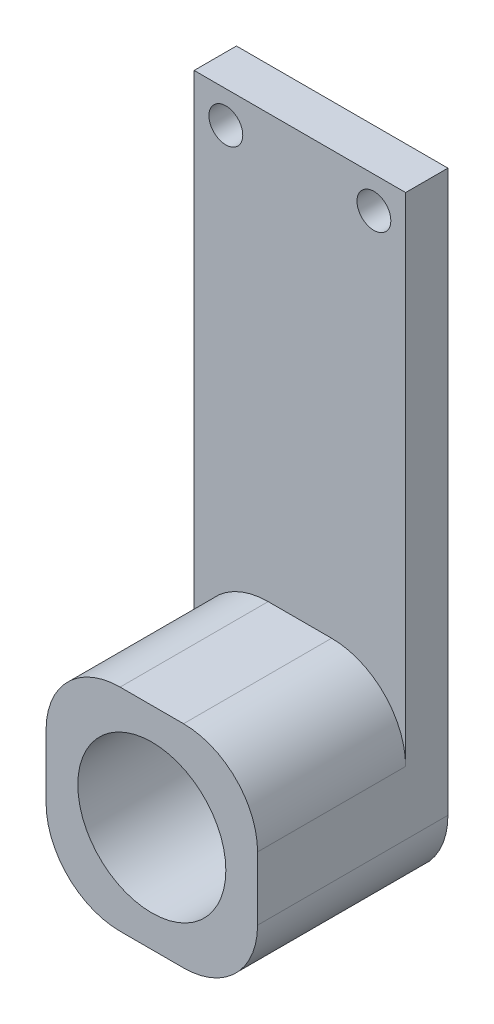
ISO-10303-21;
HEADER;
FILE_DESCRIPTION(('STEP AP214'),'2;1');
FILE_NAME('part.step','',(''),(''),'','','');
FILE_SCHEMA(('AUTOMOTIVE_DESIGN { 1 0 10303 214 1 1 1 1 }'));
ENDSEC;
DATA;
#1=APPLICATION_CONTEXT('core data for automotive mechanical design processes');
#2=APPLICATION_PROTOCOL_DEFINITION('international standard','automotive_design',2000,#1);
#3=PRODUCT_CONTEXT('',#1,'mechanical');
#4=PRODUCT('Part','Part','',(#3));
#5=PRODUCT_RELATED_PRODUCT_CATEGORY('part','',(#4));
#6=PRODUCT_DEFINITION_FORMATION('','',#4);
#7=PRODUCT_DEFINITION_CONTEXT('part definition',#1,'design');
#8=PRODUCT_DEFINITION('design','',#6,#7);
#9=PRODUCT_DEFINITION_SHAPE('','',#8);
#10=(LENGTH_UNIT() NAMED_UNIT(*) SI_UNIT(.MILLI.,.METRE.));
#11=(NAMED_UNIT(*) PLANE_ANGLE_UNIT() SI_UNIT($,.RADIAN.));
#12=(NAMED_UNIT(*) SI_UNIT($,.STERADIAN.) SOLID_ANGLE_UNIT());
#13=UNCERTAINTY_MEASURE_WITH_UNIT(LENGTH_MEASURE(1.E-05),#10,'distance_accuracy_value','');
#14=(GEOMETRIC_REPRESENTATION_CONTEXT(3) GLOBAL_UNCERTAINTY_ASSIGNED_CONTEXT((#13)) GLOBAL_UNIT_ASSIGNED_CONTEXT((#10,
#11,#12)) REPRESENTATION_CONTEXT('',''));
#15=CARTESIAN_POINT('',(0.,0.,0.));
#16=DIRECTION('',(0.,0.,1.));
#17=DIRECTION('',(1.,0.,0.));
#18=AXIS2_PLACEMENT_3D('',#15,#16,#17);
#19=CARTESIAN_POINT('',(-17.8635678666033,21.6884788398443,2.));
#20=DIRECTION('',(1.,0.,0.));
#21=DIRECTION('',(0.,1.,0.));
#22=AXIS2_PLACEMENT_3D('',#19,#20,#21);
#23=PLANE('',#22);
#24=DIRECTION('',(0.,-1.,0.));
#25=VECTOR('',#24,1.);
#26=CARTESIAN_POINT('',(-17.8635678666033,21.6884788398443,0.));
#27=LINE('',#26,#25);
#28=CARTESIAN_POINT('',(-17.8635678666033,21.6884788398443,0.));
#29=VERTEX_POINT('',#28);
#30=CARTESIAN_POINT('',(-17.8635678666033,-4.8115211601557,0.));
#31=VERTEX_POINT('',#30);
#32=EDGE_CURVE('E137',#29,#31,#27,.T.);
#33=ORIENTED_EDGE('',*,*,#32,.T.);
#34=DIRECTION('',(0.,0.,-1.));
#35=VECTOR('',#34,1.);
#36=CARTESIAN_POINT('',(-17.8635678666033,-4.8115211601557,2.));
#37=LINE('',#36,#35);
#38=CARTESIAN_POINT('',(-17.8635678666033,-4.8115211601557,9.));
#39=VERTEX_POINT('',#38);
#40=EDGE_CURVE('E159',#31,#39,#37,.F.);
#41=ORIENTED_EDGE('',*,*,#40,.T.);
#42=DIRECTION('',(0.,-1.,0.));
#43=VECTOR('',#42,1.);
#44=CARTESIAN_POINT('',(-17.8635678666033,1.68847883984431,9.));
#45=LINE('',#44,#43);
#46=CARTESIAN_POINT('',(-17.8635678666033,-1.81152116015569,9.));
#47=VERTEX_POINT('',#46);
#48=EDGE_CURVE('E157',#47,#39,#45,.T.);
#49=ORIENTED_EDGE('',*,*,#48,.F.);
#50=DIRECTION('',(0.,0.,-1.));
#51=VECTOR('',#50,1.);
#52=CARTESIAN_POINT('',(-17.8635678666033,-1.81152116015569,2.));
#53=LINE('',#52,#51);
#54=CARTESIAN_POINT('',(-17.8635678666033,-1.81152116015569,2.));
#55=VERTEX_POINT('',#54);
#56=EDGE_CURVE('E185',#47,#55,#53,.T.);
#57=ORIENTED_EDGE('',*,*,#56,.T.);
#58=DIRECTION('',(0.,-1.,0.));
#59=VECTOR('',#58,1.);
#60=CARTESIAN_POINT('',(-17.8635678666033,21.6884788398443,2.));
#61=LINE('',#60,#59);
#62=CARTESIAN_POINT('',(-17.8635678666033,21.6884788398443,2.));
#63=VERTEX_POINT('',#62);
#64=EDGE_CURVE('E114',#63,#55,#61,.T.);
#65=ORIENTED_EDGE('',*,*,#64,.F.);
#66=DIRECTION('',(0.,0.,-1.));
#67=VECTOR('',#66,1.);
#68=CARTESIAN_POINT('',(-17.8635678666033,21.6884788398443,2.));
#69=LINE('',#68,#67);
#70=EDGE_CURVE('E126',#63,#29,#69,.T.);
#71=ORIENTED_EDGE('',*,*,#70,.T.);
#72=EDGE_LOOP('',(#33,#41,#49,#57,#65,#71));
#73=FACE_BOUND('',#72,.T.);
#74=ADVANCED_FACE('F33',(#73),#23,.F.);
#75=CARTESIAN_POINT('',(-17.8635678666033,-8.3115211601557,2.));
#76=DIRECTION('',(0.,1.,0.));
#77=DIRECTION('',(0.,0.,1.));
#78=AXIS2_PLACEMENT_3D('',#75,#76,#77);
#79=PLANE('',#78);
#80=DIRECTION('',(1.,0.,0.));
#81=VECTOR('',#80,1.);
#82=CARTESIAN_POINT('',(-17.8635678666033,-8.3115211601557,0.));
#83=LINE('',#82,#81);
#84=CARTESIAN_POINT('',(-14.3635678666033,-8.3115211601557,0.));
#85=VERTEX_POINT('',#84);
#86=CARTESIAN_POINT('',(-11.3635678666033,-8.3115211601557,0.));
#87=VERTEX_POINT('',#86);
#88=EDGE_CURVE('E140',#85,#87,#83,.T.);
#89=ORIENTED_EDGE('',*,*,#88,.T.);
#90=DIRECTION('',(0.,0.,-1.));
#91=VECTOR('',#90,1.);
#92=CARTESIAN_POINT('',(-11.3635678666033,-8.3115211601557,2.));
#93=LINE('',#92,#91);
#94=CARTESIAN_POINT('',(-11.3635678666033,-8.3115211601557,9.));
#95=VERTEX_POINT('',#94);
#96=EDGE_CURVE('E190',#87,#95,#93,.F.);
#97=ORIENTED_EDGE('',*,*,#96,.T.);
#98=DIRECTION('',(1.,0.,0.));
#99=VECTOR('',#98,1.);
#100=CARTESIAN_POINT('',(-17.8635678666033,-8.3115211601557,9.));
#101=LINE('',#100,#99);
#102=CARTESIAN_POINT('',(-14.3635678666033,-8.3115211601557,9.));
#103=VERTEX_POINT('',#102);
#104=EDGE_CURVE('E200',#103,#95,#101,.T.);
#105=ORIENTED_EDGE('',*,*,#104,.F.);
#106=DIRECTION('',(0.,0.,-1.));
#107=VECTOR('',#106,1.);
#108=CARTESIAN_POINT('',(-14.3635678666033,-8.3115211601557,2.));
#109=LINE('',#108,#107);
#110=EDGE_CURVE('E205',#103,#85,#109,.T.);
#111=ORIENTED_EDGE('',*,*,#110,.T.);
#112=EDGE_LOOP('',(#89,#97,#105,#111));
#113=FACE_BOUND('',#112,.T.);
#114=ADVANCED_FACE('F226',(#113),#79,.F.);
#115=CARTESIAN_POINT('',(-7.86356786660326,21.6884788398443,2.));
#116=DIRECTION('',(-1.,0.,0.));
#117=DIRECTION('',(0.,-1.,0.));
#118=AXIS2_PLACEMENT_3D('',#115,#116,#117);
#119=PLANE('',#118);
#120=DIRECTION('',(0.,1.,0.));
#121=VECTOR('',#120,1.);
#122=CARTESIAN_POINT('',(-7.86356786660326,1.6884788398443,9.));
#123=LINE('',#122,#121);
#124=CARTESIAN_POINT('',(-7.86356786660326,-4.8115211601557,9.));
#125=VERTEX_POINT('',#124);
#126=CARTESIAN_POINT('',(-7.86356786660326,-1.8115211601557,9.));
#127=VERTEX_POINT('',#126);
#128=EDGE_CURVE('E181',#125,#127,#123,.T.);
#129=ORIENTED_EDGE('',*,*,#128,.F.);
#130=DIRECTION('',(0.,0.,-1.));
#131=VECTOR('',#130,1.);
#132=CARTESIAN_POINT('',(-7.86356786660326,-4.8115211601557,2.));
#133=LINE('',#132,#131);
#134=CARTESIAN_POINT('',(-7.86356786660326,-4.8115211601557,0.));
#135=VERTEX_POINT('',#134);
#136=EDGE_CURVE('E214',#125,#135,#133,.T.);
#137=ORIENTED_EDGE('',*,*,#136,.T.);
#138=DIRECTION('',(0.,1.,0.));
#139=VECTOR('',#138,1.);
#140=CARTESIAN_POINT('',(-7.86356786660326,21.6884788398443,0.));
#141=LINE('',#140,#139);
#142=CARTESIAN_POINT('',(-7.86356786660326,21.6884788398443,0.));
#143=VERTEX_POINT('',#142);
#144=EDGE_CURVE('E122',#135,#143,#141,.T.);
#145=ORIENTED_EDGE('',*,*,#144,.T.);
#146=DIRECTION('',(0.,0.,-1.));
#147=VECTOR('',#146,1.);
#148=CARTESIAN_POINT('',(-7.86356786660326,21.6884788398443,2.));
#149=LINE('',#148,#147);
#150=CARTESIAN_POINT('',(-7.86356786660326,21.6884788398443,2.));
#151=VERTEX_POINT('',#150);
#152=EDGE_CURVE('E117',#151,#143,#149,.T.);
#153=ORIENTED_EDGE('',*,*,#152,.F.);
#154=DIRECTION('',(0.,1.,0.));
#155=VECTOR('',#154,1.);
#156=CARTESIAN_POINT('',(-7.86356786660326,21.6884788398443,2.));
#157=LINE('',#156,#155);
#158=CARTESIAN_POINT('',(-7.86356786660326,-1.8115211601557,2.));
#159=VERTEX_POINT('',#158);
#160=EDGE_CURVE('E107',#159,#151,#157,.T.);
#161=ORIENTED_EDGE('',*,*,#160,.F.);
#162=DIRECTION('',(0.,0.,-1.));
#163=VECTOR('',#162,1.);
#164=CARTESIAN_POINT('',(-7.86356786660326,-1.81152116015569,2.));
#165=LINE('',#164,#163);
#166=EDGE_CURVE('E125',#159,#127,#165,.F.);
#167=ORIENTED_EDGE('',*,*,#166,.T.);
#168=EDGE_LOOP('',(#129,#137,#145,#153,#161,#167));
#169=FACE_BOUND('',#168,.T.);
#170=ADVANCED_FACE('F119',(#169),#119,.F.);
#171=CARTESIAN_POINT('',(-17.8635678666033,21.6884788398443,2.));
#172=DIRECTION('',(0.,-1.,0.));
#173=DIRECTION('',(0.,0.,-1.));
#174=AXIS2_PLACEMENT_3D('',#171,#172,#173);
#175=PLANE('',#174);
#176=DIRECTION('',(-1.,0.,0.));
#177=VECTOR('',#176,1.);
#178=CARTESIAN_POINT('',(-17.8635678666033,21.6884788398443,0.));
#179=LINE('',#178,#177);
#180=EDGE_CURVE('E145',#143,#29,#179,.T.);
#181=ORIENTED_EDGE('',*,*,#180,.T.);
#182=ORIENTED_EDGE('',*,*,#70,.F.);
#183=DIRECTION('',(-1.,0.,0.));
#184=VECTOR('',#183,1.);
#185=CARTESIAN_POINT('',(-17.8635678666033,21.6884788398443,2.));
#186=LINE('',#185,#184);
#187=EDGE_CURVE('E111',#151,#63,#186,.T.);
#188=ORIENTED_EDGE('',*,*,#187,.F.);
#189=ORIENTED_EDGE('',*,*,#152,.T.);
#190=EDGE_LOOP('',(#181,#182,#188,#189));
#191=FACE_BOUND('',#190,.T.);
#192=ADVANCED_FACE('F128',(#191),#175,.F.);
#193=CARTESIAN_POINT('',(0.,0.,2.));
#194=DIRECTION('',(0.,0.,1.));
#195=DIRECTION('',(1.,0.,0.));
#196=AXIS2_PLACEMENT_3D('',#193,#194,#195);
#197=PLANE('',#196);
#198=CARTESIAN_POINT('',(-9.36356786660326,20.1884788398443,2.));
#199=DIRECTION('',(0.,0.,1.));
#200=DIRECTION('',(1.,0.,0.));
#201=AXIS2_PLACEMENT_3D('',#198,#199,#200);
#202=CIRCLE('',#201,0.8);
#203=CARTESIAN_POINT('',(-8.56356786660326,20.1884788398443,2.));
#204=VERTEX_POINT('',#203);
#205=EDGE_CURVE('E393',#204,#204,#202,.T.);
#206=ORIENTED_EDGE('',*,*,#205,.F.);
#207=EDGE_LOOP('',(#206));
#208=FACE_BOUND('',#207,.T.);
#209=CARTESIAN_POINT('',(-16.3635678666033,20.1884788398443,2.));
#210=DIRECTION('',(0.,0.,1.));
#211=DIRECTION('',(1.,0.,0.));
#212=AXIS2_PLACEMENT_3D('',#209,#210,#211);
#213=CIRCLE('',#212,0.8);
#214=CARTESIAN_POINT('',(-15.5635678666033,20.1884788398443,2.));
#215=VERTEX_POINT('',#214);
#216=EDGE_CURVE('E384',#215,#215,#213,.T.);
#217=ORIENTED_EDGE('',*,*,#216,.F.);
#218=EDGE_LOOP('',(#217));
#219=FACE_BOUND('',#218,.T.);
#220=DIRECTION('',(-1.,0.,0.));
#221=VECTOR('',#220,1.);
#222=CARTESIAN_POINT('',(-17.8635678666033,1.68847883984431,2.));
#223=LINE('',#222,#221);
#224=CARTESIAN_POINT('',(-11.3635678666033,1.6884788398443,2.));
#225=VERTEX_POINT('',#224);
#226=CARTESIAN_POINT('',(-14.3635678666033,1.6884788398443,2.));
#227=VERTEX_POINT('',#226);
#228=EDGE_CURVE('E154',#225,#227,#223,.T.);
#229=ORIENTED_EDGE('',*,*,#228,.F.);
#230=CARTESIAN_POINT('',(-11.3635678666033,-1.8115211601557,2.));
#231=DIRECTION('',(0.,0.,1.));
#232=DIRECTION('',(1.,0.,0.));
#233=AXIS2_PLACEMENT_3D('',#230,#231,#232);
#234=CIRCLE('',#233,3.5);
#235=EDGE_CURVE('E11',#225,#159,#234,.F.);
#236=ORIENTED_EDGE('',*,*,#235,.T.);
#237=ORIENTED_EDGE('',*,*,#160,.T.);
#238=ORIENTED_EDGE('',*,*,#187,.T.);
#239=ORIENTED_EDGE('',*,*,#64,.T.);
#240=CARTESIAN_POINT('',(-14.3635678666033,-1.81152116015569,2.));
#241=DIRECTION('',(0.,0.,1.));
#242=DIRECTION('',(1.,0.,0.));
#243=AXIS2_PLACEMENT_3D('',#240,#241,#242);
#244=CIRCLE('',#243,3.5);
#245=EDGE_CURVE('E41',#55,#227,#244,.F.);
#246=ORIENTED_EDGE('',*,*,#245,.T.);
#247=EDGE_LOOP('',(#229,#236,#237,#238,#239,#246));
#248=FACE_BOUND('',#247,.T.);
#249=ADVANCED_FACE('F109',(#208,#219,#248),#197,.T.);
#250=CARTESIAN_POINT('',(0.,0.,0.));
#251=DIRECTION('',(0.,0.,1.));
#252=DIRECTION('',(1.,0.,0.));
#253=AXIS2_PLACEMENT_3D('',#250,#251,#252);
#254=PLANE('',#253);
#255=CARTESIAN_POINT('',(-12.8635678666033,-3.3115211601557,0.));
#256=DIRECTION('',(0.,0.,1.));
#257=DIRECTION('',(1.,0.,0.));
#258=AXIS2_PLACEMENT_3D('',#255,#256,#257);
#259=CIRCLE('',#258,1.5);
#260=CARTESIAN_POINT('',(-11.3635678666033,-3.3115211601557,0.));
#261=VERTEX_POINT('',#260);
#262=EDGE_CURVE('E396',#261,#261,#259,.T.);
#263=ORIENTED_EDGE('',*,*,#262,.T.);
#264=EDGE_LOOP('',(#263));
#265=FACE_BOUND('',#264,.T.);
#266=CARTESIAN_POINT('',(-9.36356786660326,20.1884788398443,0.));
#267=DIRECTION('',(0.,0.,1.));
#268=DIRECTION('',(1.,0.,0.));
#269=AXIS2_PLACEMENT_3D('',#266,#267,#268);
#270=CIRCLE('',#269,0.8);
#271=CARTESIAN_POINT('',(-8.56356786660326,20.1884788398443,0.));
#272=VERTEX_POINT('',#271);
#273=EDGE_CURVE('E391',#272,#272,#270,.T.);
#274=ORIENTED_EDGE('',*,*,#273,.T.);
#275=EDGE_LOOP('',(#274));
#276=FACE_BOUND('',#275,.T.);
#277=CARTESIAN_POINT('',(-16.3635678666033,20.1884788398443,0.));
#278=DIRECTION('',(0.,0.,1.));
#279=DIRECTION('',(1.,0.,0.));
#280=AXIS2_PLACEMENT_3D('',#277,#278,#279);
#281=CIRCLE('',#280,0.8);
#282=CARTESIAN_POINT('',(-15.5635678666033,20.1884788398443,0.));
#283=VERTEX_POINT('',#282);
#284=EDGE_CURVE('E380',#283,#283,#281,.T.);
#285=ORIENTED_EDGE('',*,*,#284,.T.);
#286=EDGE_LOOP('',(#285));
#287=FACE_BOUND('',#286,.T.);
#288=ORIENTED_EDGE('',*,*,#144,.F.);
#289=CARTESIAN_POINT('',(-11.3635678666033,-4.8115211601557,0.));
#290=DIRECTION('',(0.,0.,1.));
#291=DIRECTION('',(1.,0.,0.));
#292=AXIS2_PLACEMENT_3D('',#289,#290,#291);
#293=CIRCLE('',#292,3.5);
#294=EDGE_CURVE('E209',#135,#87,#293,.F.);
#295=ORIENTED_EDGE('',*,*,#294,.T.);
#296=ORIENTED_EDGE('',*,*,#88,.F.);
#297=CARTESIAN_POINT('',(-14.3635678666033,-4.8115211601557,0.));
#298=DIRECTION('',(0.,0.,1.));
#299=DIRECTION('',(1.,0.,0.));
#300=AXIS2_PLACEMENT_3D('',#297,#298,#299);
#301=CIRCLE('',#300,3.5);
#302=EDGE_CURVE('E206',#85,#31,#301,.F.);
#303=ORIENTED_EDGE('',*,*,#302,.T.);
#304=ORIENTED_EDGE('',*,*,#32,.F.);
#305=ORIENTED_EDGE('',*,*,#180,.F.);
#306=EDGE_LOOP('',(#288,#295,#296,#303,#304,#305));
#307=FACE_BOUND('',#306,.T.);
#308=ADVANCED_FACE('F259',(#265,#276,#287,#307),#254,.F.);
#309=CARTESIAN_POINT('',(0.,0.,9.));
#310=DIRECTION('',(0.,0.,1.));
#311=DIRECTION('',(1.,0.,0.));
#312=AXIS2_PLACEMENT_3D('',#309,#310,#311);
#313=PLANE('',#312);
#314=ORIENTED_EDGE('',*,*,#104,.T.);
#315=CARTESIAN_POINT('',(-11.3635678666033,-4.8115211601557,9.));
#316=DIRECTION('',(0.,0.,1.));
#317=DIRECTION('',(1.,0.,0.));
#318=AXIS2_PLACEMENT_3D('',#315,#316,#317);
#319=CIRCLE('',#318,3.5);
#320=EDGE_CURVE('E188',#95,#125,#319,.T.);
#321=ORIENTED_EDGE('',*,*,#320,.T.);
#322=ORIENTED_EDGE('',*,*,#128,.T.);
#323=CARTESIAN_POINT('',(-11.3635678666033,-1.8115211601557,9.));
#324=DIRECTION('',(0.,0.,1.));
#325=DIRECTION('',(1.,0.,0.));
#326=AXIS2_PLACEMENT_3D('',#323,#324,#325);
#327=CIRCLE('',#326,3.5);
#328=CARTESIAN_POINT('',(-11.3635678666033,1.6884788398443,9.));
#329=VERTEX_POINT('',#328);
#330=EDGE_CURVE('E180',#127,#329,#327,.T.);
#331=ORIENTED_EDGE('',*,*,#330,.T.);
#332=DIRECTION('',(-1.,0.,0.));
#333=VECTOR('',#332,1.);
#334=CARTESIAN_POINT('',(-17.8635678666033,1.68847883984431,9.));
#335=LINE('',#334,#333);
#336=CARTESIAN_POINT('',(-14.3635678666033,1.6884788398443,9.));
#337=VERTEX_POINT('',#336);
#338=EDGE_CURVE('E141',#329,#337,#335,.T.);
#339=ORIENTED_EDGE('',*,*,#338,.T.);
#340=CARTESIAN_POINT('',(-14.3635678666033,-1.81152116015569,9.));
#341=DIRECTION('',(0.,0.,1.));
#342=DIRECTION('',(1.,0.,0.));
#343=AXIS2_PLACEMENT_3D('',#340,#341,#342);
#344=CIRCLE('',#343,3.5);
#345=EDGE_CURVE('E176',#337,#47,#344,.T.);
#346=ORIENTED_EDGE('',*,*,#345,.T.);
#347=ORIENTED_EDGE('',*,*,#48,.T.);
#348=CARTESIAN_POINT('',(-14.3635678666033,-4.8115211601557,9.));
#349=DIRECTION('',(0.,0.,1.));
#350=DIRECTION('',(1.,0.,0.));
#351=AXIS2_PLACEMENT_3D('',#348,#349,#350);
#352=CIRCLE('',#351,3.5);
#353=EDGE_CURVE('E186',#39,#103,#352,.T.);
#354=ORIENTED_EDGE('',*,*,#353,.T.);
#355=EDGE_LOOP('',(#314,#321,#322,#331,#339,#346,#347,#354));
#356=FACE_BOUND('',#355,.T.);
#357=CARTESIAN_POINT('',(-12.8635678666033,-3.3115211601557,9.));
#358=DIRECTION('',(0.,0.,1.));
#359=DIRECTION('',(1.,0.,0.));
#360=AXIS2_PLACEMENT_3D('',#357,#358,#359);
#361=CIRCLE('',#360,3.5);
#362=CARTESIAN_POINT('',(-9.36356786660326,-3.3115211601557,9.));
#363=VERTEX_POINT('',#362);
#364=EDGE_CURVE('E158',#363,#363,#361,.T.);
#365=ORIENTED_EDGE('',*,*,#364,.F.);
#366=EDGE_LOOP('',(#365));
#367=FACE_BOUND('',#366,.T.);
#368=ADVANCED_FACE('F173',(#356,#367),#313,.T.);
#369=CARTESIAN_POINT('',(-17.8635678666033,1.68847883984431,9.));
#370=DIRECTION('',(0.,-1.,0.));
#371=DIRECTION('',(1.,0.,0.));
#372=AXIS2_PLACEMENT_3D('',#369,#370,#371);
#373=PLANE('',#372);
#374=ORIENTED_EDGE('',*,*,#228,.T.);
#375=DIRECTION('',(0.,0.,-1.));
#376=VECTOR('',#375,1.);
#377=CARTESIAN_POINT('',(-14.3635678666033,1.6884788398443,9.));
#378=LINE('',#377,#376);
#379=EDGE_CURVE('E163',#227,#337,#378,.F.);
#380=ORIENTED_EDGE('',*,*,#379,.T.);
#381=ORIENTED_EDGE('',*,*,#338,.F.);
#382=DIRECTION('',(0.,0.,-1.));
#383=VECTOR('',#382,1.);
#384=CARTESIAN_POINT('',(-11.3635678666033,1.6884788398443,9.));
#385=LINE('',#384,#383);
#386=EDGE_CURVE('E161',#329,#225,#385,.T.);
#387=ORIENTED_EDGE('',*,*,#386,.T.);
#388=EDGE_LOOP('',(#374,#380,#381,#387));
#389=FACE_BOUND('',#388,.T.);
#390=ADVANCED_FACE('F168',(#389),#373,.F.);
#391=CARTESIAN_POINT('',(-12.8635678666033,-3.3115211601557,9.));
#392=DIRECTION('',(0.,0.,-1.));
#393=DIRECTION('',(-1.,0.,0.));
#394=AXIS2_PLACEMENT_3D('',#391,#392,#393);
#395=CYLINDRICAL_SURFACE('',#394,3.5);
#396=ORIENTED_EDGE('',*,*,#364,.T.);
#397=EDGE_LOOP('',(#396));
#398=FACE_BOUND('',#397,.T.);
#399=CARTESIAN_POINT('',(-12.8635678666033,-3.3115211601557,2.));
#400=DIRECTION('',(0.,0.,1.));
#401=DIRECTION('',(1.,0.,0.));
#402=AXIS2_PLACEMENT_3D('',#399,#400,#401);
#403=CIRCLE('',#402,3.5);
#404=CARTESIAN_POINT('',(-9.36356786660326,-3.3115211601557,2.));
#405=VERTEX_POINT('',#404);
#406=EDGE_CURVE('E378',#405,#405,#403,.T.);
#407=ORIENTED_EDGE('',*,*,#406,.F.);
#408=EDGE_LOOP('',(#407));
#409=FACE_BOUND('',#408,.T.);
#410=ADVANCED_FACE('F274',(#398,#409),#395,.F.);
#411=CARTESIAN_POINT('',(-12.8635678666033,-3.3115211601557,2.));
#412=DIRECTION('',(0.,0.,1.));
#413=DIRECTION('',(1.,0.,0.));
#414=AXIS2_PLACEMENT_3D('',#411,#412,#413);
#415=CIRCLE('',#414,1.5);
#416=CARTESIAN_POINT('',(-11.3635678666033,-3.3115211601557,2.));
#417=VERTEX_POINT('',#416);
#418=EDGE_CURVE('E399',#417,#417,#415,.T.);
#419=ORIENTED_EDGE('',*,*,#418,.F.);
#420=EDGE_LOOP('',(#419));
#421=FACE_BOUND('',#420,.T.);
#422=ORIENTED_EDGE('',*,*,#406,.T.);
#423=EDGE_LOOP('',(#422));
#424=FACE_BOUND('',#423,.T.);
#425=ADVANCED_FACE('F269',(#421,#424),#197,.T.);
#426=CARTESIAN_POINT('',(-16.3635678666033,20.1884788398443,0.));
#427=DIRECTION('',(0.,0.,1.));
#428=DIRECTION('',(1.,0.,0.));
#429=AXIS2_PLACEMENT_3D('',#426,#427,#428);
#430=CYLINDRICAL_SURFACE('',#429,0.8);
#431=ORIENTED_EDGE('',*,*,#284,.F.);
#432=EDGE_LOOP('',(#431));
#433=FACE_BOUND('',#432,.T.);
#434=ORIENTED_EDGE('',*,*,#216,.T.);
#435=EDGE_LOOP('',(#434));
#436=FACE_BOUND('',#435,.T.);
#437=ADVANCED_FACE('F273',(#433,#436),#430,.F.);
#438=CARTESIAN_POINT('',(-9.36356786660326,20.1884788398443,0.));
#439=DIRECTION('',(0.,0.,1.));
#440=DIRECTION('',(1.,0.,0.));
#441=AXIS2_PLACEMENT_3D('',#438,#439,#440);
#442=CYLINDRICAL_SURFACE('',#441,0.8);
#443=ORIENTED_EDGE('',*,*,#273,.F.);
#444=EDGE_LOOP('',(#443));
#445=FACE_BOUND('',#444,.T.);
#446=ORIENTED_EDGE('',*,*,#205,.T.);
#447=EDGE_LOOP('',(#446));
#448=FACE_BOUND('',#447,.T.);
#449=ADVANCED_FACE('F237',(#445,#448),#442,.F.);
#450=CARTESIAN_POINT('',(-11.3635678666033,-4.8115211601557,2.));
#451=DIRECTION('',(0.,0.,-1.));
#452=DIRECTION('',(-1.,0.,0.));
#453=AXIS2_PLACEMENT_3D('',#450,#451,#452);
#454=CYLINDRICAL_SURFACE('',#453,3.5);
#455=ORIENTED_EDGE('',*,*,#320,.F.);
#456=ORIENTED_EDGE('',*,*,#96,.F.);
#457=ORIENTED_EDGE('',*,*,#294,.F.);
#458=ORIENTED_EDGE('',*,*,#136,.F.);
#459=EDGE_LOOP('',(#455,#456,#457,#458));
#460=FACE_BOUND('',#459,.T.);
#461=ADVANCED_FACE('F234',(#460),#454,.T.);
#462=CARTESIAN_POINT('',(-14.3635678666033,-4.8115211601557,2.));
#463=DIRECTION('',(0.,0.,-1.));
#464=DIRECTION('',(-1.,0.,0.));
#465=AXIS2_PLACEMENT_3D('',#462,#463,#464);
#466=CYLINDRICAL_SURFACE('',#465,3.5);
#467=ORIENTED_EDGE('',*,*,#353,.F.);
#468=ORIENTED_EDGE('',*,*,#40,.F.);
#469=ORIENTED_EDGE('',*,*,#302,.F.);
#470=ORIENTED_EDGE('',*,*,#110,.F.);
#471=EDGE_LOOP('',(#467,#468,#469,#470));
#472=FACE_BOUND('',#471,.T.);
#473=ADVANCED_FACE('F203',(#472),#466,.T.);
#474=CARTESIAN_POINT('',(-14.3635678666033,-1.81152116015569,2.));
#475=DIRECTION('',(0.,0.,-1.));
#476=DIRECTION('',(-1.,0.,0.));
#477=AXIS2_PLACEMENT_3D('',#474,#475,#476);
#478=CYLINDRICAL_SURFACE('',#477,3.5);
#479=ORIENTED_EDGE('',*,*,#345,.F.);
#480=ORIENTED_EDGE('',*,*,#379,.F.);
#481=ORIENTED_EDGE('',*,*,#245,.F.);
#482=ORIENTED_EDGE('',*,*,#56,.F.);
#483=EDGE_LOOP('',(#479,#480,#481,#482));
#484=FACE_BOUND('',#483,.T.);
#485=ADVANCED_FACE('F183',(#484),#478,.T.);
#486=CARTESIAN_POINT('',(-11.3635678666033,-1.8115211601557,9.));
#487=DIRECTION('',(0.,0.,-1.));
#488=DIRECTION('',(-1.,0.,0.));
#489=AXIS2_PLACEMENT_3D('',#486,#487,#488);
#490=CYLINDRICAL_SURFACE('',#489,3.5);
#491=ORIENTED_EDGE('',*,*,#330,.F.);
#492=ORIENTED_EDGE('',*,*,#166,.F.);
#493=ORIENTED_EDGE('',*,*,#235,.F.);
#494=ORIENTED_EDGE('',*,*,#386,.F.);
#495=EDGE_LOOP('',(#491,#492,#493,#494));
#496=FACE_BOUND('',#495,.T.);
#497=ADVANCED_FACE('F35',(#496),#490,.T.);
#498=CARTESIAN_POINT('',(-12.8635678666033,-3.3115211601557,0.));
#499=DIRECTION('',(0.,0.,1.));
#500=DIRECTION('',(1.,0.,0.));
#501=AXIS2_PLACEMENT_3D('',#498,#499,#500);
#502=CYLINDRICAL_SURFACE('',#501,1.5);
#503=ORIENTED_EDGE('',*,*,#262,.F.);
#504=EDGE_LOOP('',(#503));
#505=FACE_BOUND('',#504,.T.);
#506=ORIENTED_EDGE('',*,*,#418,.T.);
#507=EDGE_LOOP('',(#506));
#508=FACE_BOUND('',#507,.T.);
#509=ADVANCED_FACE('F218',(#505,#508),#502,.F.);
#510=CLOSED_SHELL('',(#74,#114,#170,#192,#249,#308,#368,#390,#410,#425,#437,#449,#461,#473,#485,
#497,#509));
#511=MANIFOLD_SOLID_BREP('B2',#510);
#512=ADVANCED_BREP_SHAPE_REPRESENTATION('',(#18,#511),#14);
#513=SHAPE_DEFINITION_REPRESENTATION(#9,#512);
ENDSEC;
END-ISO-10303-21;
